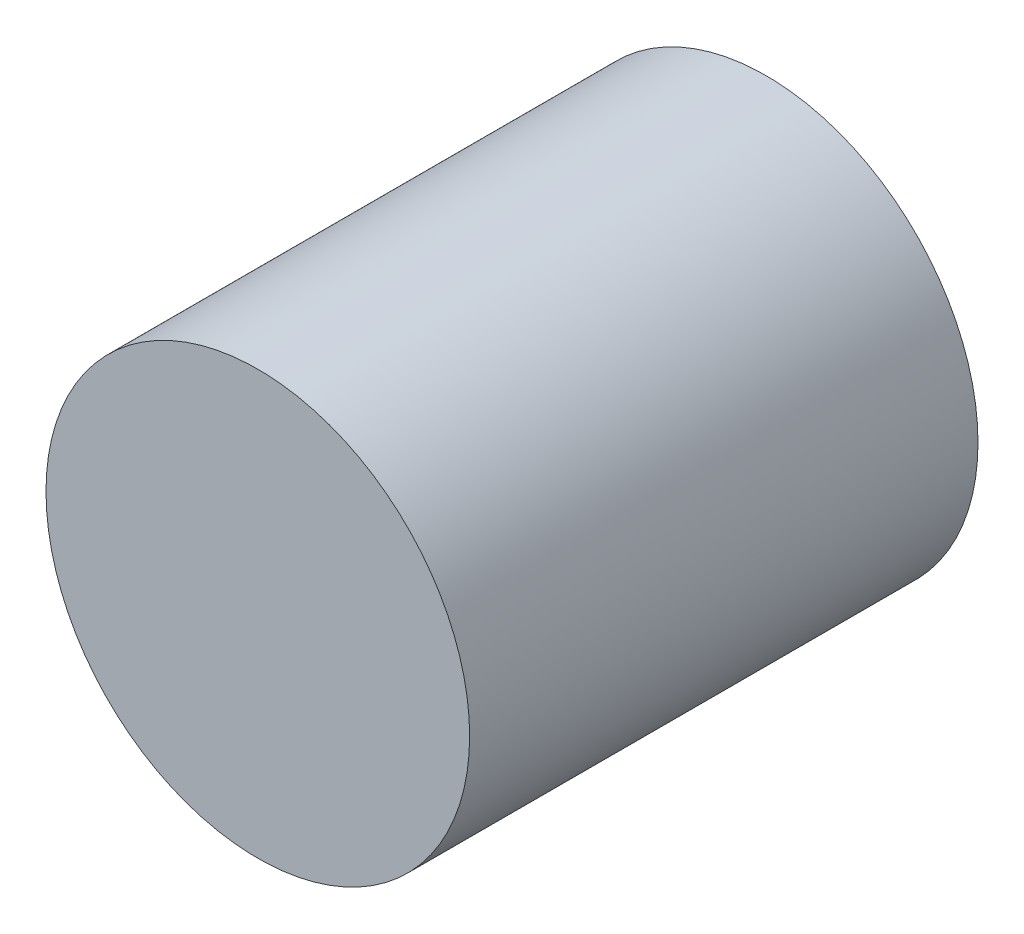
ISO-10303-21;
HEADER;
FILE_DESCRIPTION(('STEP AP214'),'2;1');
FILE_NAME('part.step','',(''),(''),'','','');
FILE_SCHEMA(('AUTOMOTIVE_DESIGN { 1 0 10303 214 1 1 1 1 }'));
ENDSEC;
DATA;
#1=APPLICATION_CONTEXT('core data for automotive mechanical design processes');
#2=APPLICATION_PROTOCOL_DEFINITION('international standard','automotive_design',2000,#1);
#3=PRODUCT_CONTEXT('',#1,'mechanical');
#4=PRODUCT('Part','Part','',(#3));
#5=PRODUCT_RELATED_PRODUCT_CATEGORY('part','',(#4));
#6=PRODUCT_DEFINITION_FORMATION('','',#4);
#7=PRODUCT_DEFINITION_CONTEXT('part definition',#1,'design');
#8=PRODUCT_DEFINITION('design','',#6,#7);
#9=PRODUCT_DEFINITION_SHAPE('','',#8);
#10=(LENGTH_UNIT() NAMED_UNIT(*) SI_UNIT(.MILLI.,.METRE.));
#11=(NAMED_UNIT(*) PLANE_ANGLE_UNIT() SI_UNIT($,.RADIAN.));
#12=(NAMED_UNIT(*) SI_UNIT($,.STERADIAN.) SOLID_ANGLE_UNIT());
#13=UNCERTAINTY_MEASURE_WITH_UNIT(LENGTH_MEASURE(1.E-05),#10,'distance_accuracy_value','');
#14=(GEOMETRIC_REPRESENTATION_CONTEXT(3) GLOBAL_UNCERTAINTY_ASSIGNED_CONTEXT((#13)) GLOBAL_UNIT_ASSIGNED_CONTEXT((#10,
#11,#12)) REPRESENTATION_CONTEXT('',''));
#15=CARTESIAN_POINT('',(0.,0.,0.));
#16=DIRECTION('',(0.,0.,1.));
#17=DIRECTION('',(1.,0.,0.));
#18=AXIS2_PLACEMENT_3D('',#15,#16,#17);
#19=CARTESIAN_POINT('',(0.,0.,9.));
#20=DIRECTION('',(0.,0.,-1.));
#21=DIRECTION('',(-1.,0.,0.));
#22=AXIS2_PLACEMENT_3D('',#19,#20,#21);
#23=CYLINDRICAL_SURFACE('',#22,3.75);
#24=CARTESIAN_POINT('',(0.,0.,9.));
#25=DIRECTION('',(0.,0.,1.));
#26=DIRECTION('',(1.,0.,0.));
#27=AXIS2_PLACEMENT_3D('',#24,#25,#26);
#28=CIRCLE('',#27,3.75);
#29=CARTESIAN_POINT('',(3.75,0.,9.));
#30=VERTEX_POINT('',#29);
#31=EDGE_CURVE('E10',#30,#30,#28,.T.);
#32=ORIENTED_EDGE('',*,*,#31,.F.);
#33=EDGE_LOOP('',(#32));
#34=FACE_BOUND('',#33,.T.);
#35=CARTESIAN_POINT('',(0.,0.,0.));
#36=DIRECTION('',(0.,0.,1.));
#37=DIRECTION('',(1.,0.,0.));
#38=AXIS2_PLACEMENT_3D('',#35,#36,#37);
#39=CIRCLE('',#38,3.75);
#40=CARTESIAN_POINT('',(3.75,0.,0.));
#41=VERTEX_POINT('',#40);
#42=EDGE_CURVE('E31',#41,#41,#39,.T.);
#43=ORIENTED_EDGE('',*,*,#42,.T.);
#44=EDGE_LOOP('',(#43));
#45=FACE_BOUND('',#44,.T.);
#46=ADVANCED_FACE('F28',(#34,#45),#23,.T.);
#47=CARTESIAN_POINT('',(0.,0.,9.));
#48=DIRECTION('',(0.,0.,1.));
#49=DIRECTION('',(1.,0.,0.));
#50=AXIS2_PLACEMENT_3D('',#47,#48,#49);
#51=PLANE('',#50);
#52=ORIENTED_EDGE('',*,*,#31,.T.);
#53=EDGE_LOOP('',(#52));
#54=FACE_BOUND('',#53,.T.);
#55=ADVANCED_FACE('F43',(#54),#51,.T.);
#56=CARTESIAN_POINT('',(0.,0.,0.));
#57=DIRECTION('',(0.,0.,1.));
#58=DIRECTION('',(1.,0.,0.));
#59=AXIS2_PLACEMENT_3D('',#56,#57,#58);
#60=PLANE('',#59);
#61=ORIENTED_EDGE('',*,*,#42,.F.);
#62=EDGE_LOOP('',(#61));
#63=FACE_BOUND('',#62,.T.);
#64=ADVANCED_FACE('F41',(#63),#60,.F.);
#65=CLOSED_SHELL('',(#46,#55,#64));
#66=MANIFOLD_SOLID_BREP('B2',#65);
#67=ADVANCED_BREP_SHAPE_REPRESENTATION('',(#18,#66),#14);
#68=SHAPE_DEFINITION_REPRESENTATION(#9,#67);
ENDSEC;
END-ISO-10303-21;
